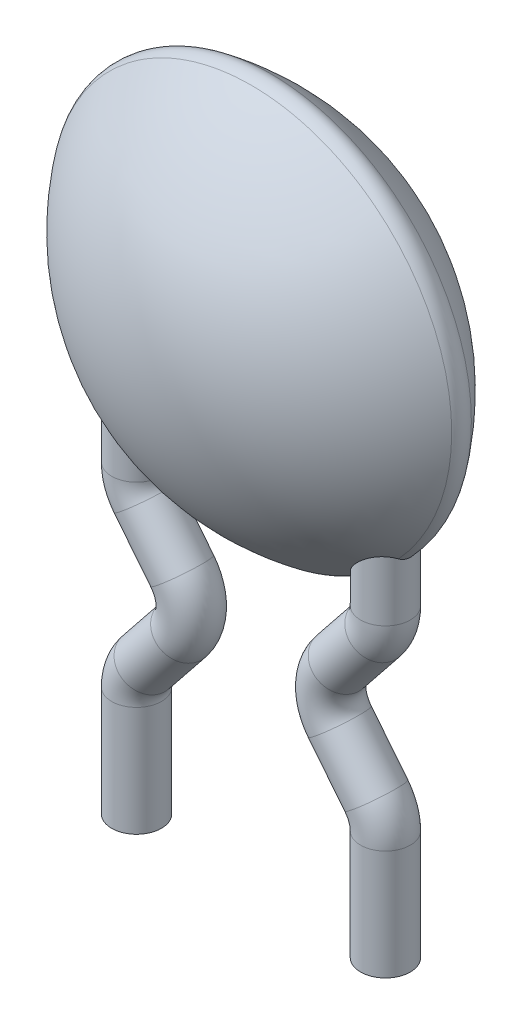
ISO-10303-21;
HEADER;
FILE_DESCRIPTION(('STEP AP214'),'2;1');
FILE_NAME('part.step','',(''),(''),'','','');
FILE_SCHEMA(('AUTOMOTIVE_DESIGN { 1 0 10303 214 1 1 1 1 }'));
ENDSEC;
DATA;
#1=APPLICATION_CONTEXT('core data for automotive mechanical design processes');
#2=APPLICATION_PROTOCOL_DEFINITION('international standard','automotive_design',2000,#1);
#3=PRODUCT_CONTEXT('',#1,'mechanical');
#4=PRODUCT('Part','Part','',(#3));
#5=PRODUCT_RELATED_PRODUCT_CATEGORY('part','',(#4));
#6=PRODUCT_DEFINITION_FORMATION('','',#4);
#7=PRODUCT_DEFINITION_CONTEXT('part definition',#1,'design');
#8=PRODUCT_DEFINITION('design','',#6,#7);
#9=PRODUCT_DEFINITION_SHAPE('','',#8);
#10=(LENGTH_UNIT() NAMED_UNIT(*) SI_UNIT(.MILLI.,.METRE.));
#11=(NAMED_UNIT(*) PLANE_ANGLE_UNIT() SI_UNIT($,.RADIAN.));
#12=(NAMED_UNIT(*) SI_UNIT($,.STERADIAN.) SOLID_ANGLE_UNIT());
#13=UNCERTAINTY_MEASURE_WITH_UNIT(LENGTH_MEASURE(1.E-05),#10,'distance_accuracy_value','');
#14=(GEOMETRIC_REPRESENTATION_CONTEXT(3) GLOBAL_UNCERTAINTY_ASSIGNED_CONTEXT((#13)) GLOBAL_UNIT_ASSIGNED_CONTEXT((#10,
#11,#12)) REPRESENTATION_CONTEXT('',''));
#15=CARTESIAN_POINT('',(0.,0.,0.));
#16=DIRECTION('',(0.,0.,1.));
#17=DIRECTION('',(1.,0.,0.));
#18=AXIS2_PLACEMENT_3D('',#15,#16,#17);
#19=CARTESIAN_POINT('',(0.,6.,-1.6583123951777));
#20=DIRECTION('',(0.,1.,0.));
#21=DIRECTION('',(0.,0.,1.));
#22=AXIS2_PLACEMENT_3D('',#19,#20,#21);
#23=SPHERICAL_SURFACE('',#22,3.);
#24=CARTESIAN_POINT('',(0.,6.,0.118450885369835));
#25=DIRECTION('',(0.,0.,1.));
#26=DIRECTION('',(-1.,0.,0.));
#27=AXIS2_PLACEMENT_3D('',#24,#25,#26);
#28=CIRCLE('',#27,2.41725303700253);
#29=CARTESIAN_POINT('',(1.77562544830821,4.35979680764296,0.118450885369837));
#30=VERTEX_POINT('',#29);
#31=CARTESIAN_POINT('',(-1.77562544830821,4.35979680764296,0.118450885369835));
#32=VERTEX_POINT('',#31);
#33=EDGE_CURVE('E11',#30,#32,#28,.T.);
#34=ORIENTED_EDGE('',*,*,#33,.T.);
#35=CARTESIAN_POINT('',(-1.77562544830821,4.35979680764296,0.118450885369835));
#36=CARTESIAN_POINT('',(-1.77177194447377,4.36534779995318,0.12742743215577));
#37=CARTESIAN_POINT('',(-1.76736227008728,4.37048542995669,0.136469091716055));
#38=CARTESIAN_POINT('',(-1.75733642965905,4.37968148603928,0.154548561014207));
#39=CARTESIAN_POINT('',(-1.7517100337576,4.38373006468388,0.163585643281366));
#40=CARTESIAN_POINT('',(-1.73917931603369,4.39041077196987,0.181418194730474));
#41=CARTESIAN_POINT('',(-1.73226647474882,4.3930329715797,0.190211575783705));
#42=CARTESIAN_POINT('',(-1.71732227815066,4.39653275959631,0.207116951426043));
#43=CARTESIAN_POINT('',(-1.70929598869573,4.39741798894627,0.215231779285135));
#44=CARTESIAN_POINT('',(-1.69315503552242,4.39736299476173,0.229778603477736));
#45=CARTESIAN_POINT('',(-1.68511694885147,4.3965837632623,0.236296797505597));
#46=CARTESIAN_POINT('',(-1.66858053193431,4.39359920622341,0.248366067656619));
#47=CARTESIAN_POINT('',(-1.66008147339955,4.39139156003165,0.253915551316519));
#48=CARTESIAN_POINT('',(-1.64096635920844,4.38510626231128,0.265098093957448));
#49=CARTESIAN_POINT('',(-1.63030165034382,4.38072096850384,0.270472696149906));
#50=CARTESIAN_POINT('',(-1.60901756033425,4.37052034894376,0.279733008352717));
#51=CARTESIAN_POINT('',(-1.59839827705825,4.36470278136259,0.283616359593319));
#52=CARTESIAN_POINT('',(-1.57260082001439,4.3491179546753,0.291522421941028));
#53=CARTESIAN_POINT('',(-1.55755484354581,4.338760091375,0.294799255480215));
#54=CARTESIAN_POINT('',(-1.52820559404503,4.31663935046043,0.299040075090939));
#55=CARTESIAN_POINT('',(-1.51390380267335,4.30487381305328,0.299999607821787));
#56=CARTESIAN_POINT('',(-1.48096873162263,4.27594009402119,0.300000536806296));
#57=CARTESIAN_POINT('',(-1.46268312010573,4.25837962794931,0.298204063462647));
#58=CARTESIAN_POINT('',(-1.4276146134614,4.22233734803466,0.291681868325126));
#59=CARTESIAN_POINT('',(-1.41083391341997,4.20385424763985,0.286951944815329));
#60=CARTESIAN_POINT('',(-1.37061379795436,4.15685738948633,0.271896682734009));
#61=CARTESIAN_POINT('',(-1.34813765928644,4.12803086411685,0.2599483381057));
#62=CARTESIAN_POINT('',(-1.30694537634714,4.07027145083639,0.23100205595987));
#63=CARTESIAN_POINT('',(-1.28822697570815,4.04133863744018,0.214007163979129));
#64=CARTESIAN_POINT('',(-1.26220743756968,3.99623554654242,0.18349340221486));
#65=CARTESIAN_POINT('',(-1.25342574627078,3.97984279729134,0.171544273769393));
#66=CARTESIAN_POINT('',(-1.23757185848718,3.94746699220698,0.146129407645501));
#67=CARTESIAN_POINT('',(-1.23049671556717,3.93148327345254,0.132666343653857));
#68=CARTESIAN_POINT('',(-1.22437455169179,3.91576891826566,0.118450885369833));
#69=B_SPLINE_CURVE_WITH_KNOTS('',3,(#35,#36,#37,#38,#39,#40,#41,#42,#43,#44,#45,#46,#47,#48,#49,
#50,#51,#52,#53,#54,#55,#56,#57,#58,#59,#60,#61,#62,#63,#64,#65,#66,#67,#68),.UNSPECIFIED.,.F.,
.F.,(4,2,2,2,2,2,2,2,2,2,2,2,2,2,2,2,4),(0.,0.0337452880177605,0.0677861662502321,
0.102061065789782,0.136184848769055,0.167158097864954,0.198181793961417,0.236138337095641,
0.274154672679362,0.329528088609578,0.385007835638743,0.460947489016898,0.536996166277296,
0.651790086729908,0.766514870600366,0.832719283380476,0.898808559560753),.UNSPECIFIED.);
#70=CARTESIAN_POINT('',(-1.22437455169179,3.91576891826566,0.118450885369834));
#71=VERTEX_POINT('',#70);
#72=EDGE_CURVE('E66',#32,#71,#69,.T.);
#73=ORIENTED_EDGE('',*,*,#72,.T.);
#74=CARTESIAN_POINT('',(0.,6.,0.118450885369836));
#75=DIRECTION('',(0.,0.,1.));
#76=DIRECTION('',(-1.,0.,0.));
#77=AXIS2_PLACEMENT_3D('',#74,#75,#76);
#78=CIRCLE('',#77,2.41725303700253);
#79=CARTESIAN_POINT('',(1.22437455169179,3.91576891826566,0.118450885369835));
#80=VERTEX_POINT('',#79);
#81=EDGE_CURVE('E33',#71,#80,#78,.T.);
#82=ORIENTED_EDGE('',*,*,#81,.T.);
#83=CARTESIAN_POINT('',(1.22437455169179,3.91576891826566,0.118450885369835));
#84=CARTESIAN_POINT('',(1.22930092239239,3.92842372247154,0.129900724915372));
#85=CARTESIAN_POINT('',(1.23485059607963,3.94125486244177,0.140861640703045));
#86=CARTESIAN_POINT('',(1.24707199695731,3.96717760626011,0.161786338766388));
#87=CARTESIAN_POINT('',(1.25374292274573,3.9802690182306,0.171750825172264));
#88=CARTESIAN_POINT('',(1.27533955129213,4.0199637437782,0.200245174021742));
#89=CARTESIAN_POINT('',(1.29179404666761,4.0468508082788,0.217253497800425));
#90=CARTESIAN_POINT('',(1.32846650849411,4.10126376566344,0.247287407748771));
#91=CARTESIAN_POINT('',(1.3487578074511,4.1287909607529,0.260219465985845));
#92=CARTESIAN_POINT('',(1.39247238845603,4.18314155758901,0.28111055459828));
#93=CARTESIAN_POINT('',(1.41588269767469,4.20996735168286,0.289089447845041));
#94=CARTESIAN_POINT('',(1.45022803015928,4.24566191740957,0.295997147086889));
#95=CARTESIAN_POINT('',(1.45986558626398,4.25532146709056,0.297468200115527));
#96=CARTESIAN_POINT('',(1.47959431106201,4.27428917164689,0.299469733461145));
#97=CARTESIAN_POINT('',(1.48968580018592,4.28359706948592,0.299999538320604));
#98=CARTESIAN_POINT('',(1.513497986362,4.30451865844315,0.300000604190562));
#99=CARTESIAN_POINT('',(1.52737739666993,4.31595721443351,0.299094632396366));
#100=CARTESIAN_POINT('',(1.5558477940061,4.33752633521877,0.29510530896612));
#101=CARTESIAN_POINT('',(1.5704379851695,4.34765831862941,0.292024342784049));
#102=CARTESIAN_POINT('',(1.59549095373894,4.36303056463353,0.284595953184856));
#103=CARTESIAN_POINT('',(1.60582393831878,4.36881153690582,0.280941832190029));
#104=CARTESIAN_POINT('',(1.62655557643697,4.37905193928932,0.27223062084095));
#105=CARTESIAN_POINT('',(1.63695408859974,4.3835135977137,0.267175924353922));
#106=CARTESIAN_POINT('',(1.6558053098137,4.39012702558145,0.25655668153789));
#107=CARTESIAN_POINT('',(1.66429259546462,4.39254031243666,0.251218780216571));
#108=CARTESIAN_POINT('',(1.68086588886182,4.39598358986709,0.239561844014326));
#109=CARTESIAN_POINT('',(1.68895219364168,4.39701461957275,0.233243550148249));
#110=CARTESIAN_POINT('',(1.70447712650894,4.39759460533404,0.219761273750442));
#111=CARTESIAN_POINT('',(1.71191430168919,4.39714032003484,0.212595474598694));
#112=CARTESIAN_POINT('',(1.72590703666769,4.39478839007788,0.197663560532647));
#113=CARTESIAN_POINT('',(1.73246202944263,4.39288982227198,0.189897064521724));
#114=CARTESIAN_POINT('',(1.7444443374403,4.38787538421365,0.174191323950394));
#115=CARTESIAN_POINT('',(1.74989277035537,4.38478641426287,0.166259325393118));
#116=CARTESIAN_POINT('',(1.75982740604106,4.3776036239941,0.150261356025673));
#117=CARTESIAN_POINT('',(1.76431367274002,4.37350987047482,0.142195394154699));
#118=CARTESIAN_POINT('',(1.77096093764852,4.36610192782197,0.12889698656099));
#119=CARTESIAN_POINT('',(1.77338498705207,4.36301949485377,0.123665101406839));
#120=CARTESIAN_POINT('',(1.77562544830821,4.35979680764297,0.118450885369839));
#121=B_SPLINE_CURVE_WITH_KNOTS('',3,(#83,#84,#85,#86,#87,#88,#89,#90,#91,#92,#93,#94,#95,#96,
#97,#98,#99,#100,#101,#102,#103,#104,#105,#106,#107,#108,#109,#110,#111,#112,#113,#114,#115,
#116,#117,#118,#119,#120),.UNSPECIFIED.,.F.,.F.,(4,2,2,2,2,2,2,2,2,2,2,2,2,2,2,2,2,2,4),(0.,
0.0532412347793843,0.106444576569104,0.213419143281168,0.322694502238762,0.431528772315132,
0.472667989425504,0.51383671691086,0.567713404568972,0.621531093872992,0.658587142205838,
0.695580240839867,0.726386583160666,0.757169753387557,0.788020145528891,0.818890273030889,
0.849100241925074,0.879308202983311,0.898898345181588),.UNSPECIFIED.);
#122=EDGE_CURVE('E42',#80,#30,#121,.T.);
#123=ORIENTED_EDGE('',*,*,#122,.T.);
#124=EDGE_LOOP('',(#34,#73,#82,#123));
#125=FACE_BOUND('',#124,.T.);
#126=ADVANCED_FACE('F16',(#125),#23,.T.);
#127=CARTESIAN_POINT('',(0.,6.,0.));
#128=DIRECTION('',(0.,0.,-1.));
#129=DIRECTION('',(-1.,0.,0.));
#130=AXIS2_PLACEMENT_3D('',#127,#128,#129);
#131=TOROIDAL_SURFACE('',#130,2.2561028345357,0.19999999999999);
#132=CARTESIAN_POINT('',(1.77562544830821,4.35979680764297,0.11845088536984));
#133=CARTESIAN_POINT('',(1.77942814099474,4.35435630641426,0.109649804800582));
#134=CARTESIAN_POINT('',(1.78293752633034,4.34966318713888,0.100274848532239));
#135=CARTESIAN_POINT('',(1.78912066108772,4.34173338335793,0.0806932216809891));
#136=CARTESIAN_POINT('',(1.79179600951748,4.33849390663451,0.070488190491416));
#137=CARTESIAN_POINT('',(1.7959159883274,4.33360536288386,0.0503220933458154));
#138=CARTESIAN_POINT('',(1.79743864831195,4.33185420542867,0.0404013476177549));
#139=CARTESIAN_POINT('',(1.7994807854875,4.32952151056591,0.0203208848049185));
#140=CARTESIAN_POINT('',(1.80000013399791,4.32894012318781,0.0101611372358707));
#141=CARTESIAN_POINT('',(1.79999985360155,4.32894010946173,-0.0111014767404297));
#142=CARTESIAN_POINT('',(1.79937962709211,4.32963406730214,-0.0222046122561676));
#143=CARTESIAN_POINT('',(1.79694525199059,4.33242143908817,-0.0441025415075207));
#144=CARTESIAN_POINT('',(1.79513088881281,4.33451510456156,-0.0548972794604166));
#145=CARTESIAN_POINT('',(1.79066627265907,4.3398695175406,-0.0748825469331065));
#146=CARTESIAN_POINT('',(1.78811036741871,4.34300240132467,-0.0841285823228596));
#147=CARTESIAN_POINT('',(1.78232480469204,4.35048073691349,-0.101892156939798));
#148=CARTESIAN_POINT('',(1.7790949795535,4.35482649053699,-0.1104095141476));
#149=CARTESIAN_POINT('',(1.77562544830821,4.35979680764297,-0.118450885369832));
#150=B_SPLINE_CURVE_WITH_KNOTS('',3,(#132,#133,#134,#135,#136,#137,#138,#139,#140,#141,#142,
#143,#144,#145,#146,#147,#148,#149),.UNSPECIFIED.,.F.,.F.,(4,2,2,2,2,2,2,2,4),(0.,
0.0330128428864743,0.0659619989846288,0.0964091041337876,0.126860114043343,0.160129143915325,
0.193404153846566,0.22355859850625,0.253720553702946),.UNSPECIFIED.);
#151=CARTESIAN_POINT('',(1.77562544830821,4.35979680764297,-0.118450885369834));
#152=VERTEX_POINT('',#151);
#153=EDGE_CURVE('E87',#30,#152,#150,.T.);
#154=ORIENTED_EDGE('',*,*,#153,.T.);
#155=CARTESIAN_POINT('',(0.,6.,-0.118450885369836));
#156=DIRECTION('',(0.,0.,1.));
#157=DIRECTION('',(-1.,0.,0.));
#158=AXIS2_PLACEMENT_3D('',#155,#156,#157);
#159=CIRCLE('',#158,2.41725303700253);
#160=CARTESIAN_POINT('',(-1.77562544830821,4.35979680764297,-0.118450885369836));
#161=VERTEX_POINT('',#160);
#162=EDGE_CURVE('E83',#152,#161,#159,.T.);
#163=ORIENTED_EDGE('',*,*,#162,.T.);
#164=CARTESIAN_POINT('',(-1.77562544830821,4.35979680764297,0.118450885369834));
#165=CARTESIAN_POINT('',(-1.77942814099474,4.35435630641426,0.109649804800575));
#166=CARTESIAN_POINT('',(-1.78293752633034,4.34966318713888,0.100274848532233));
#167=CARTESIAN_POINT('',(-1.78912066108772,4.34173338335793,0.0806932216809821));
#168=CARTESIAN_POINT('',(-1.79179600951748,4.33849390663451,0.0704881904914086));
#169=CARTESIAN_POINT('',(-1.7959159883274,4.33360536288386,0.0503220933458089));
#170=CARTESIAN_POINT('',(-1.79743864831195,4.33185420542867,0.0404013476177497));
#171=CARTESIAN_POINT('',(-1.7994807854875,4.32952151056592,0.0203208848049159));
#172=CARTESIAN_POINT('',(-1.80000013399791,4.32894012318782,0.0101611372358694));
#173=CARTESIAN_POINT('',(-1.79999985360155,4.32894010946174,-0.0111014767404297));
#174=CARTESIAN_POINT('',(-1.79937962709211,4.32963406730214,-0.0222046122561675));
#175=CARTESIAN_POINT('',(-1.79694525199059,4.33242143908818,-0.0441025415075207));
#176=CARTESIAN_POINT('',(-1.79513088881281,4.33451510456157,-0.0548972794604167));
#177=CARTESIAN_POINT('',(-1.79066627265907,4.3398695175406,-0.0748825469331074));
#178=CARTESIAN_POINT('',(-1.78811036741871,4.34300240132467,-0.0841285823228611));
#179=CARTESIAN_POINT('',(-1.78232480469204,4.3504807369135,-0.101892156939801));
#180=CARTESIAN_POINT('',(-1.7790949795535,4.354826490537,-0.110409514147603));
#181=CARTESIAN_POINT('',(-1.77562544830821,4.35979680764297,-0.118450885369836));
#182=B_SPLINE_CURVE_WITH_KNOTS('',3,(#164,#165,#166,#167,#168,#169,#170,#171,#172,#173,#174,
#175,#176,#177,#178,#179,#180,#181),.UNSPECIFIED.,.F.,.F.,(4,2,2,2,2,2,2,2,4),(0.,
0.0330128428864745,0.0659619989846291,0.096409104133784,0.126860114043335,0.160129143915317,
0.193404153846559,0.223558598506245,0.253720553702942),.UNSPECIFIED.);
#183=EDGE_CURVE('E21',#32,#161,#182,.T.);
#184=ORIENTED_EDGE('',*,*,#183,.F.);
#185=ORIENTED_EDGE('',*,*,#33,.F.);
#186=EDGE_LOOP('',(#154,#163,#184,#185));
#187=FACE_BOUND('',#186,.T.);
#188=ADVANCED_FACE('F81',(#187),#131,.T.);
#189=CARTESIAN_POINT('',(1.34031242374329,2.5,0.));
#190=DIRECTION('',(0.,0.,-1.));
#191=DIRECTION('',(-1.,0.,0.));
#192=AXIS2_PLACEMENT_3D('',#189,#190,#191);
#193=TOROIDAL_SURFACE('',#192,0.500000000000005,0.3);
#194=CARTESIAN_POINT('',(0.949878019021769,2.18765247622279,0.));
#195=DIRECTION('',(-0.624695047554423,0.780868809443031,0.));
#196=DIRECTION('',(-0.780868809443031,-0.624695047554423,0.));
#197=AXIS2_PLACEMENT_3D('',#194,#195,#196);
#198=CIRCLE('',#197,0.3);
#199=CARTESIAN_POINT('',(0.715617376188857,2.00024396195646,0.));
#200=VERTEX_POINT('',#199);
#201=EDGE_CURVE('E235',#200,#200,#198,.T.);
#202=CARTESIAN_POINT('',(0.94987801902177,2.81234752377721,0.));
#203=DIRECTION('',(0.624695047554425,0.78086880944303,0.));
#204=DIRECTION('',(-0.78086880944303,0.624695047554425,0.));
#205=AXIS2_PLACEMENT_3D('',#202,#203,#204);
#206=CIRCLE('',#205,0.3);
#207=CARTESIAN_POINT('',(0.71561737618886,2.99975603804354,0.));
#208=VERTEX_POINT('',#207);
#209=EDGE_CURVE('E85',#208,#208,#206,.T.);
#210=CARTESIAN_POINT('',(1.34031242374329,2.5,0.));
#211=DIRECTION('',(0.,0.,-1.));
#212=DIRECTION('',(-1.,0.,0.));
#213=AXIS2_PLACEMENT_3D('',#210,#211,#212);
#214=CIRCLE('',#213,0.800000000000005);
#215=EDGE_CURVE('',#200,#208,#214,.T.);
#216=ORIENTED_EDGE('',*,*,#201,.T.);
#217=ORIENTED_EDGE('',*,*,#209,.F.);
#218=ORIENTED_EDGE('',*,*,#215,.T.);
#219=ORIENTED_EDGE('',*,*,#215,.F.);
#220=EDGE_LOOP('',(#216,#218,#217,#219));
#221=FACE_BOUND('',#220,.T.);
#222=ADVANCED_FACE('F431',(#221),#193,.T.);
#223=CARTESIAN_POINT('',(-1.34031242374329,2.5,0.));
#224=DIRECTION('',(0.,0.,1.));
#225=DIRECTION('',(1.,0.,0.));
#226=AXIS2_PLACEMENT_3D('',#223,#224,#225);
#227=TOROIDAL_SURFACE('',#226,0.500000000000006,0.3);
#228=CARTESIAN_POINT('',(-0.949878019021769,2.18765247622279,0.));
#229=DIRECTION('',(0.624695047554423,0.780868809443031,0.));
#230=DIRECTION('',(0.780868809443031,-0.624695047554423,0.));
#231=AXIS2_PLACEMENT_3D('',#228,#229,#230);
#232=CIRCLE('',#231,0.3);
#233=CARTESIAN_POINT('',(-0.715617376188857,2.00024396195646,0.));
#234=VERTEX_POINT('',#233);
#235=EDGE_CURVE('E238',#234,#234,#232,.T.);
#236=CARTESIAN_POINT('',(-0.94987801902177,2.81234752377721,0.));
#237=DIRECTION('',(-0.624695047554425,0.78086880944303,0.));
#238=DIRECTION('',(-0.78086880944303,-0.624695047554425,0.));
#239=AXIS2_PLACEMENT_3D('',#236,#237,#238);
#240=CIRCLE('',#239,0.3);
#241=CARTESIAN_POINT('',(-0.71561737618886,2.99975603804354,0.));
#242=VERTEX_POINT('',#241);
#243=EDGE_CURVE('E225',#242,#242,#240,.T.);
#244=CARTESIAN_POINT('',(-1.34031242374329,2.5,0.));
#245=DIRECTION('',(0.,0.,1.));
#246=DIRECTION('',(1.,0.,0.));
#247=AXIS2_PLACEMENT_3D('',#244,#245,#246);
#248=CIRCLE('',#247,0.800000000000006);
#249=EDGE_CURVE('',#234,#242,#248,.T.);
#250=ORIENTED_EDGE('',*,*,#235,.T.);
#251=ORIENTED_EDGE('',*,*,#243,.F.);
#252=ORIENTED_EDGE('',*,*,#249,.T.);
#253=ORIENTED_EDGE('',*,*,#249,.F.);
#254=EDGE_LOOP('',(#250,#252,#251,#253));
#255=FACE_BOUND('',#254,.T.);
#256=ADVANCED_FACE('F422',(#255),#227,.T.);
#257=CARTESIAN_POINT('',(1.5,3.67539052967911,0.));
#258=DIRECTION('',(0.,1.,0.));
#259=DIRECTION('',(0.,0.,1.));
#260=AXIS2_PLACEMENT_3D('',#257,#258,#259);
#261=CYLINDRICAL_SURFACE('',#260,0.3);
#262=ORIENTED_EDGE('',*,*,#153,.F.);
#263=ORIENTED_EDGE('',*,*,#122,.F.);
#264=CARTESIAN_POINT('',(1.22437455169179,3.91576891826566,0.118450885369836));
#265=CARTESIAN_POINT('',(1.21889450334762,3.90167919293905,0.105699264502702));
#266=CARTESIAN_POINT('',(1.21362717117828,3.88887867036373,0.0909999122745261));
#267=CARTESIAN_POINT('',(1.20939582426119,3.87884004480803,0.0744930402330781));
#268=CARTESIAN_POINT('',(1.2060132605784,3.87081510832913,0.0612973493625463));
#269=CARTESIAN_POINT('',(1.20324712649781,3.86443880980648,0.0466275116826474));
#270=CARTESIAN_POINT('',(1.20164112102311,3.86075440719756,0.0313365495173723));
#271=CARTESIAN_POINT('',(1.20057104838004,3.8582995099385,0.02114826525738));
#272=CARTESIAN_POINT('',(1.1999999999998,3.85700183532166,0.0105343586498762));
#273=CARTESIAN_POINT('',(1.1999999999983,3.85700183532113,-5.13445536088756E-13));
#274=B_SPLINE_CURVE_WITH_KNOTS('',3,(#264,#265,#266,#267,#268,#269,#270,#271,#272,#273),
.UNSPECIFIED.,.F.,.F.,(4,3,3,4),(0.,5.93329260980525E-05,0.000106780704252343,
0.000138461221483342),.UNSPECIFIED.);
#275=CARTESIAN_POINT('',(1.1999999999983,3.85700183532113,-5.13445536088756E-13));
#276=VERTEX_POINT('',#275);
#277=EDGE_CURVE('E76',#80,#276,#274,.T.);
#278=ORIENTED_EDGE('',*,*,#277,.T.);
#279=CARTESIAN_POINT('',(1.1999999999983,3.85700183532113,-5.13445536088756E-13));
#280=CARTESIAN_POINT('',(1.19999999999983,3.85700183532173,-0.00545516227114814));
#281=CARTESIAN_POINT('',(1.20015002751143,3.85734347425804,-0.0109224659662742));
#282=CARTESIAN_POINT('',(1.20044466711031,3.85801617866477,-0.0163279679490866));
#283=CARTESIAN_POINT('',(1.20118498821856,3.85970643779431,-0.0299100093102573));
#284=CARTESIAN_POINT('',(1.20287503839158,3.86356547985559,-0.0433021624100061));
#285=CARTESIAN_POINT('',(1.20520977671233,3.86900209816264,-0.0556661859121668));
#286=CARTESIAN_POINT('',(1.20845601918374,3.87656122420782,-0.0728572423373431));
#287=CARTESIAN_POINT('',(1.21299971619183,3.88730383176335,-0.0885602884965187));
#288=CARTESIAN_POINT('',(1.2179634224064,3.89959705319659,-0.102251498274053));
#289=CARTESIAN_POINT('',(1.22002713666395,3.90470809225618,-0.107943766027144));
#290=CARTESIAN_POINT('',(1.22217905489168,3.91012408724846,-0.113342145254478));
#291=CARTESIAN_POINT('',(1.22437455169179,3.91576891826566,-0.118450885369836));
#292=B_SPLINE_CURVE_WITH_KNOTS('',3,(#279,#280,#281,#282,#283,#284,#285,#286,#287,#288,#289,
#290,#291),.UNSPECIFIED.,.F.,.F.,(4,3,3,3,4),(0.000138461221483342,0.000154764628127234,
0.000195802383399946,0.000253060228154902,0.000276626455606272),.UNSPECIFIED.);
#293=CARTESIAN_POINT('',(1.22437455169179,3.91576891826566,-0.118450885369836));
#294=VERTEX_POINT('',#293);
#295=EDGE_CURVE('E188',#276,#294,#292,.T.);
#296=ORIENTED_EDGE('',*,*,#295,.T.);
#297=CARTESIAN_POINT('',(1.22437455169179,3.91576891826566,-0.118450885369836));
#298=CARTESIAN_POINT('',(1.22930092239239,3.92842372247154,-0.129900724915373));
#299=CARTESIAN_POINT('',(1.23485059607963,3.94125486244176,-0.140861640703046));
#300=CARTESIAN_POINT('',(1.24707199695731,3.96717760626011,-0.161786338766387));
#301=CARTESIAN_POINT('',(1.25374292274573,3.9802690182306,-0.171750825172262));
#302=CARTESIAN_POINT('',(1.27533955129213,4.0199637437782,-0.200245174021741));
#303=CARTESIAN_POINT('',(1.29179404666761,4.0468508082788,-0.217253497800425));
#304=CARTESIAN_POINT('',(1.32846650849411,4.10126376566344,-0.247287407748773));
#305=CARTESIAN_POINT('',(1.3487578074511,4.12879096075291,-0.260219465985848));
#306=CARTESIAN_POINT('',(1.39247238845604,4.18314155758901,-0.281110554598282));
#307=CARTESIAN_POINT('',(1.4158826976747,4.20996735168286,-0.289089447845042));
#308=CARTESIAN_POINT('',(1.45022803015878,4.24566191740904,-0.295997147086789));
#309=CARTESIAN_POINT('',(1.45986558626296,4.25532146708953,-0.29746820011537));
#310=CARTESIAN_POINT('',(1.47959431105989,4.27428917164489,-0.299469733460983));
#311=CARTESIAN_POINT('',(1.48968580018323,4.28359706948346,-0.299999538320491));
#312=CARTESIAN_POINT('',(1.51349798635893,4.30451865844057,-0.30000060419071));
#313=CARTESIAN_POINT('',(1.52737739666708,4.31595721443124,-0.299094632396638));
#314=CARTESIAN_POINT('',(1.55584779400373,4.33752633521709,-0.295105308966579));
#315=CARTESIAN_POINT('',(1.57043798516739,4.34765831862802,-0.29202434278457));
#316=CARTESIAN_POINT('',(1.59549095373714,4.3630305646325,-0.284595953185459));
#317=CARTESIAN_POINT('',(1.60582393831702,4.36881153690487,-0.280941832190692));
#318=CARTESIAN_POINT('',(1.62655557643529,4.37905193928856,-0.272230620841728));
#319=CARTESIAN_POINT('',(1.63695408859811,4.38351359771305,-0.267175924354756));
#320=CARTESIAN_POINT('',(1.65580530981217,4.39012702558098,-0.256556681538817));
#321=CARTESIAN_POINT('',(1.66429259546314,4.39254031243628,-0.251218780217541));
#322=CARTESIAN_POINT('',(1.68086588886044,4.39598358986687,-0.23956184401537));
#323=CARTESIAN_POINT('',(1.68895219364035,4.39701461957262,-0.233243550149324));
#324=CARTESIAN_POINT('',(1.70447712650774,4.39759460533407,-0.21976127375156));
#325=CARTESIAN_POINT('',(1.71191430168806,4.39714032003495,-0.212595474599824));
#326=CARTESIAN_POINT('',(1.72590703666669,4.39478839007812,-0.197663560533784));
#327=CARTESIAN_POINT('',(1.73246202944171,4.39288982227228,-0.189897064522856));
#328=CARTESIAN_POINT('',(1.74444433743947,4.38787538421407,-0.174191323951548));
#329=CARTESIAN_POINT('',(1.74989277035458,4.38478641426335,-0.166259325394302));
#330=CARTESIAN_POINT('',(1.75982740604035,4.3776036239947,-0.150261356026909));
#331=CARTESIAN_POINT('',(1.76431367273935,4.37350987047547,-0.142195394155957));
#332=CARTESIAN_POINT('',(1.77096093764813,4.36610192782247,-0.12889698656184));
#333=CARTESIAN_POINT('',(1.77338498705189,4.36301949485403,-0.123665101407261));
#334=CARTESIAN_POINT('',(1.77562544830821,4.35979680764296,-0.118450885369836));
#335=B_SPLINE_CURVE_WITH_KNOTS('',3,(#297,#298,#299,#300,#301,#302,#303,#304,#305,#306,#307,
#308,#309,#310,#311,#312,#313,#314,#315,#316,#317,#318,#319,#320,#321,#322,#323,#324,#325,#326,
#327,#328,#329,#330,#331,#332,#333,#334),.UNSPECIFIED.,.F.,.F.,(4,2,2,2,2,2,2,2,2,2,2,2,2,2,2,2,
2,2,4),(0.,0.053241234779381,0.106444576569097,0.213419143281166,0.322694502238769,
0.431528772315132,0.472667989423317,0.51383671690649,0.567713404565681,0.621531093870776,
0.65858714220379,0.695580240837987,0.726386583158887,0.75716975338588,0.788020145527325,
0.818890273029432,0.849100241923546,0.879308202981714,0.898898345181587),.UNSPECIFIED.);
#336=EDGE_CURVE('E117',#294,#152,#335,.T.);
#337=ORIENTED_EDGE('',*,*,#336,.T.);
#338=EDGE_LOOP('',(#262,#263,#278,#296,#337));
#339=FACE_BOUND('',#338,.T.);
#340=CARTESIAN_POINT('',(1.5,3.67539052967911,0.));
#341=DIRECTION('',(0.,1.,0.));
#342=DIRECTION('',(0.,0.,1.));
#343=AXIS2_PLACEMENT_3D('',#340,#341,#342);
#344=CIRCLE('',#343,0.3);
#345=CARTESIAN_POINT('',(1.8,3.67539052967911,0.));
#346=VERTEX_POINT('',#345);
#347=EDGE_CURVE('E193',#346,#346,#344,.T.);
#348=ORIENTED_EDGE('',*,*,#347,.T.);
#349=EDGE_LOOP('',(#348));
#350=FACE_BOUND('',#349,.T.);
#351=ADVANCED_FACE('F103',(#339,#350),#261,.T.);
#352=CARTESIAN_POINT('',(0.,6.,0.));
#353=DIRECTION('',(0.,0.,-1.));
#354=DIRECTION('',(0.,1.,0.));
#355=AXIS2_PLACEMENT_3D('',#352,#353,#354);
#356=TOROIDAL_SURFACE('',#355,2.2561028345357,0.199999999999999);
#357=ORIENTED_EDGE('',*,*,#295,.F.);
#358=ORIENTED_EDGE('',*,*,#277,.F.);
#359=ORIENTED_EDGE('',*,*,#81,.F.);
#360=CARTESIAN_POINT('',(-1.22437455169179,3.91576891826566,0.118450885369833));
#361=CARTESIAN_POINT('',(-1.21889450334763,3.90167919293906,0.105699264502711));
#362=CARTESIAN_POINT('',(-1.21362717117829,3.88887867036375,0.090999912274552));
#363=CARTESIAN_POINT('',(-1.2093958242612,3.87884004480806,0.0744930402331229));
#364=CARTESIAN_POINT('',(-1.20601326057841,3.87081510832915,0.0612973493625885));
#365=CARTESIAN_POINT('',(-1.20324712649781,3.86443880980649,0.0466275116826848));
#366=CARTESIAN_POINT('',(-1.20164112102312,3.86075440719757,0.0313365495174046));
#367=CARTESIAN_POINT('',(-1.20057104838004,3.8582995099385,0.0211482652574022));
#368=CARTESIAN_POINT('',(-1.1999999999998,3.85700183532166,0.0105343586498873));
#369=CARTESIAN_POINT('',(-1.1999999999983,3.85700183532113,-5.13445536088755E-13));
#370=B_SPLINE_CURVE_WITH_KNOTS('',3,(#360,#361,#362,#363,#364,#365,#366,#367,#368,#369),
.UNSPECIFIED.,.F.,.F.,(4,3,3,4),(0.,5.93329260979969E-05,0.000106780704252309,
0.000138461221483342),.UNSPECIFIED.);
#371=CARTESIAN_POINT('',(-1.1999999999983,3.85700183532113,-5.13445536088755E-13));
#372=VERTEX_POINT('',#371);
#373=EDGE_CURVE('E73',#71,#372,#370,.T.);
#374=ORIENTED_EDGE('',*,*,#373,.T.);
#375=CARTESIAN_POINT('',(-1.1999999999983,3.85700183532113,-5.13445536088755E-13));
#376=CARTESIAN_POINT('',(-1.19999999999983,3.85700183532173,-0.00545516227114401));
#377=CARTESIAN_POINT('',(-1.20015002751143,3.85734347425804,-0.0109224659662658));
#378=CARTESIAN_POINT('',(-1.20044466711031,3.85801617866477,-0.0163279679490742));
#379=CARTESIAN_POINT('',(-1.20118498821856,3.8597064377943,-0.0299100093102456));
#380=CARTESIAN_POINT('',(-1.20287503839158,3.86356547985559,-0.0433021624099953));
#381=CARTESIAN_POINT('',(-1.20520977671233,3.86900209816263,-0.0556661859121568));
#382=CARTESIAN_POINT('',(-1.20845601918373,3.87656122420782,-0.0728572423373322));
#383=CARTESIAN_POINT('',(-1.21299971619183,3.88730383176334,-0.0885602884965084));
#384=CARTESIAN_POINT('',(-1.21796342240639,3.89959705319658,-0.102251498274043));
#385=CARTESIAN_POINT('',(-1.22002713666395,3.90470809225617,-0.107943766027136));
#386=CARTESIAN_POINT('',(-1.22217905489168,3.91012408724845,-0.113342145254474));
#387=CARTESIAN_POINT('',(-1.22437455169179,3.91576891826566,-0.118450885369833));
#388=B_SPLINE_CURVE_WITH_KNOTS('',3,(#375,#376,#377,#378,#379,#380,#381,#382,#383,#384,#385,
#386,#387),.UNSPECIFIED.,.F.,.F.,(4,3,3,3,4),(0.000138461221483342,0.000154764628127222,
0.000195802383399936,0.000253060228154889,0.000276626455606271),.UNSPECIFIED.);
#389=CARTESIAN_POINT('',(-1.22437455169179,3.91576891826566,-0.118450885369835));
#390=VERTEX_POINT('',#389);
#391=EDGE_CURVE('E209',#372,#390,#388,.T.);
#392=ORIENTED_EDGE('',*,*,#391,.T.);
#393=CARTESIAN_POINT('',(0.,6.,-0.118450885369836));
#394=DIRECTION('',(0.,0.,1.));
#395=DIRECTION('',(-1.,0.,0.));
#396=AXIS2_PLACEMENT_3D('',#393,#394,#395);
#397=CIRCLE('',#396,2.41725303700253);
#398=EDGE_CURVE('E204',#390,#294,#397,.T.);
#399=ORIENTED_EDGE('',*,*,#398,.T.);
#400=EDGE_LOOP('',(#357,#358,#359,#374,#392,#399));
#401=FACE_BOUND('',#400,.T.);
#402=ADVANCED_FACE('F354',(#401),#356,.T.);
#403=CARTESIAN_POINT('',(1.,3.6753905296791,0.));
#404=DIRECTION('',(0.,0.,1.));
#405=DIRECTION('',(1.,0.,0.));
#406=AXIS2_PLACEMENT_3D('',#403,#404,#405);
#407=TOROIDAL_SURFACE('',#406,0.499999999999998,0.3);
#408=CARTESIAN_POINT('',(1.39043440472152,3.36304300590189,0.));
#409=DIRECTION('',(0.624695047554424,0.78086880944303,0.));
#410=DIRECTION('',(0.78086880944303,-0.624695047554424,0.));
#411=AXIS2_PLACEMENT_3D('',#408,#409,#410);
#412=CIRCLE('',#411,0.3);
#413=CARTESIAN_POINT('',(1.62469504755443,3.17563449163557,0.));
#414=VERTEX_POINT('',#413);
#415=EDGE_CURVE('E210',#414,#414,#412,.T.);
#416=CARTESIAN_POINT('',(1.,3.6753905296791,0.));
#417=DIRECTION('',(0.,0.,1.));
#418=DIRECTION('',(1.,0.,0.));
#419=AXIS2_PLACEMENT_3D('',#416,#417,#418);
#420=CIRCLE('',#419,0.799999999999998);
#421=EDGE_CURVE('',#414,#346,#420,.T.);
#422=ORIENTED_EDGE('',*,*,#415,.T.);
#423=ORIENTED_EDGE('',*,*,#347,.F.);
#424=ORIENTED_EDGE('',*,*,#421,.T.);
#425=ORIENTED_EDGE('',*,*,#421,.F.);
#426=EDGE_LOOP('',(#422,#424,#423,#425));
#427=FACE_BOUND('',#426,.T.);
#428=ADVANCED_FACE('F130',(#427),#407,.T.);
#429=CARTESIAN_POINT('',(-1.5,3.67539052967911,0.));
#430=DIRECTION('',(0.,1.,0.));
#431=DIRECTION('',(0.,0.,1.));
#432=AXIS2_PLACEMENT_3D('',#429,#430,#431);
#433=CYLINDRICAL_SURFACE('',#432,0.3);
#434=ORIENTED_EDGE('',*,*,#72,.F.);
#435=ORIENTED_EDGE('',*,*,#183,.T.);
#436=CARTESIAN_POINT('',(-1.22437455169179,3.91576891826566,-0.118450885369834));
#437=CARTESIAN_POINT('',(-1.22930092239239,3.92842372247154,-0.129900724915371));
#438=CARTESIAN_POINT('',(-1.23485059607963,3.94125486244176,-0.140861640703043));
#439=CARTESIAN_POINT('',(-1.2470719969573,3.9671776062601,-0.161786338766384));
#440=CARTESIAN_POINT('',(-1.25374292274572,3.98026901823059,-0.17175082517226));
#441=CARTESIAN_POINT('',(-1.27533955129213,4.0199637437782,-0.200245174021739));
#442=CARTESIAN_POINT('',(-1.29179404666761,4.0468508082788,-0.217253497800422));
#443=CARTESIAN_POINT('',(-1.32846650849411,4.10126376566343,-0.247287407748771));
#444=CARTESIAN_POINT('',(-1.3487578074511,4.1287909607529,-0.260219465985846));
#445=CARTESIAN_POINT('',(-1.39247238845604,4.18314155758901,-0.28111055459828));
#446=CARTESIAN_POINT('',(-1.41588269767469,4.20996735168286,-0.289089447845041));
#447=CARTESIAN_POINT('',(-1.45022803015878,4.24566191740904,-0.295997147086788));
#448=CARTESIAN_POINT('',(-1.45986558626295,4.25532146708953,-0.29746820011537));
#449=CARTESIAN_POINT('',(-1.47959431105989,4.27428917164489,-0.299469733460983));
#450=CARTESIAN_POINT('',(-1.48968580018323,4.28359706948346,-0.299999538320491));
#451=CARTESIAN_POINT('',(-1.51349798635893,4.30451865844057,-0.30000060419071));
#452=CARTESIAN_POINT('',(-1.52737739666708,4.31595721443124,-0.299094632396638));
#453=CARTESIAN_POINT('',(-1.55584779400373,4.33752633521709,-0.295105308966579));
#454=CARTESIAN_POINT('',(-1.57043798516739,4.34765831862802,-0.29202434278457));
#455=CARTESIAN_POINT('',(-1.59549095373714,4.3630305646325,-0.284595953185459));
#456=CARTESIAN_POINT('',(-1.60582393831702,4.36881153690487,-0.280941832190692));
#457=CARTESIAN_POINT('',(-1.62655557643529,4.37905193928856,-0.272230620841728));
#458=CARTESIAN_POINT('',(-1.63695408859811,4.38351359771305,-0.267175924354756));
#459=CARTESIAN_POINT('',(-1.65580530981217,4.39012702558098,-0.256556681538817));
#460=CARTESIAN_POINT('',(-1.66429259546314,4.39254031243628,-0.251218780217541));
#461=CARTESIAN_POINT('',(-1.68086588886044,4.39598358986687,-0.23956184401537));
#462=CARTESIAN_POINT('',(-1.68895219364035,4.39701461957262,-0.233243550149324));
#463=CARTESIAN_POINT('',(-1.70447712650774,4.39759460533407,-0.219761273751561));
#464=CARTESIAN_POINT('',(-1.71191430168806,4.39714032003495,-0.212595474599824));
#465=CARTESIAN_POINT('',(-1.72590703666669,4.39478839007812,-0.197663560533784));
#466=CARTESIAN_POINT('',(-1.73246202944171,4.39288982227228,-0.189897064522856));
#467=CARTESIAN_POINT('',(-1.74444433743947,4.38787538421407,-0.174191323951548));
#468=CARTESIAN_POINT('',(-1.74989277035458,4.38478641426335,-0.166259325394301));
#469=CARTESIAN_POINT('',(-1.75982740604035,4.3776036239947,-0.150261356026908));
#470=CARTESIAN_POINT('',(-1.76431367273935,4.37350987047547,-0.142195394155956));
#471=CARTESIAN_POINT('',(-1.77096093764813,4.36610192782247,-0.128896986561841));
#472=CARTESIAN_POINT('',(-1.77338498705189,4.36301949485403,-0.123665101407264));
#473=CARTESIAN_POINT('',(-1.77562544830821,4.35979680764296,-0.118450885369841));
#474=B_SPLINE_CURVE_WITH_KNOTS('',3,(#436,#437,#438,#439,#440,#441,#442,#443,#444,#445,#446,
#447,#448,#449,#450,#451,#452,#453,#454,#455,#456,#457,#458,#459,#460,#461,#462,#463,#464,#465,
#466,#467,#468,#469,#470,#471,#472,#473),.UNSPECIFIED.,.F.,.F.,(4,2,2,2,2,2,2,2,2,2,2,2,2,2,2,2,
2,2,4),(0.,0.0532412347793798,0.106444576569096,0.213419143281165,0.322694502238768,
0.431528772315131,0.472667989423318,0.513836716906494,0.567713404565684,0.62153109387078,
0.658587142203795,0.695580240837991,0.726386583158891,0.757169753385884,0.788020145527329,
0.818890273029436,0.84910024192355,0.879308202981719,0.898898345181586),.UNSPECIFIED.);
#475=EDGE_CURVE('E84',#390,#161,#474,.T.);
#476=ORIENTED_EDGE('',*,*,#475,.F.);
#477=ORIENTED_EDGE('',*,*,#391,.F.);
#478=ORIENTED_EDGE('',*,*,#373,.F.);
#479=EDGE_LOOP('',(#434,#435,#476,#477,#478));
#480=FACE_BOUND('',#479,.T.);
#481=CARTESIAN_POINT('',(-1.5,3.67539052967911,0.));
#482=DIRECTION('',(0.,1.,0.));
#483=DIRECTION('',(0.,0.,1.));
#484=AXIS2_PLACEMENT_3D('',#481,#482,#483);
#485=CIRCLE('',#484,0.3);
#486=CARTESIAN_POINT('',(-1.8,3.67539052967911,0.));
#487=VERTEX_POINT('',#486);
#488=EDGE_CURVE('E229',#487,#487,#485,.T.);
#489=ORIENTED_EDGE('',*,*,#488,.T.);
#490=EDGE_LOOP('',(#489));
#491=FACE_BOUND('',#490,.T.);
#492=ADVANCED_FACE('F68',(#480,#491),#433,.T.);
#493=CARTESIAN_POINT('',(0.94987801902177,2.81234752377721,0.));
#494=DIRECTION('',(0.624695047554425,0.78086880944303,0.));
#495=DIRECTION('',(-0.78086880944303,0.624695047554425,0.));
#496=AXIS2_PLACEMENT_3D('',#493,#494,#495);
#497=CYLINDRICAL_SURFACE('',#496,0.3);
#498=ORIENTED_EDGE('',*,*,#415,.F.);
#499=EDGE_LOOP('',(#498));
#500=FACE_BOUND('',#499,.T.);
#501=ORIENTED_EDGE('',*,*,#209,.T.);
#502=EDGE_LOOP('',(#501));
#503=FACE_BOUND('',#502,.T.);
#504=ADVANCED_FACE('F129',(#500,#503),#497,.T.);
#505=CARTESIAN_POINT('',(-1.,3.6753905296791,0.));
#506=DIRECTION('',(0.,0.,-1.));
#507=DIRECTION('',(-1.,0.,0.));
#508=AXIS2_PLACEMENT_3D('',#505,#506,#507);
#509=TOROIDAL_SURFACE('',#508,0.499999999999998,0.3);
#510=CARTESIAN_POINT('',(-1.39043440472152,3.36304300590189,0.));
#511=DIRECTION('',(-0.624695047554424,0.78086880944303,0.));
#512=DIRECTION('',(-0.78086880944303,-0.624695047554424,0.));
#513=AXIS2_PLACEMENT_3D('',#510,#511,#512);
#514=CIRCLE('',#513,0.3);
#515=CARTESIAN_POINT('',(-1.62469504755443,3.17563449163557,0.));
#516=VERTEX_POINT('',#515);
#517=EDGE_CURVE('E232',#516,#516,#514,.T.);
#518=CARTESIAN_POINT('',(-1.,3.6753905296791,0.));
#519=DIRECTION('',(0.,0.,-1.));
#520=DIRECTION('',(-1.,0.,0.));
#521=AXIS2_PLACEMENT_3D('',#518,#519,#520);
#522=CIRCLE('',#521,0.799999999999998);
#523=EDGE_CURVE('',#516,#487,#522,.T.);
#524=ORIENTED_EDGE('',*,*,#517,.T.);
#525=ORIENTED_EDGE('',*,*,#488,.F.);
#526=ORIENTED_EDGE('',*,*,#523,.T.);
#527=ORIENTED_EDGE('',*,*,#523,.F.);
#528=EDGE_LOOP('',(#524,#526,#525,#527));
#529=FACE_BOUND('',#528,.T.);
#530=ADVANCED_FACE('F135',(#529),#509,.T.);
#531=CARTESIAN_POINT('',(-0.94987801902177,2.81234752377721,0.));
#532=DIRECTION('',(-0.624695047554425,0.78086880944303,0.));
#533=DIRECTION('',(-0.78086880944303,-0.624695047554425,0.));
#534=AXIS2_PLACEMENT_3D('',#531,#532,#533);
#535=CYLINDRICAL_SURFACE('',#534,0.3);
#536=ORIENTED_EDGE('',*,*,#517,.F.);
#537=EDGE_LOOP('',(#536));
#538=FACE_BOUND('',#537,.T.);
#539=ORIENTED_EDGE('',*,*,#243,.T.);
#540=EDGE_LOOP('',(#539));
#541=FACE_BOUND('',#540,.T.);
#542=ADVANCED_FACE('F137',(#538,#541),#535,.T.);
#543=CARTESIAN_POINT('',(1.39043440472152,1.63695699409811,0.));
#544=DIRECTION('',(-0.624695047554425,0.78086880944303,0.));
#545=DIRECTION('',(-0.78086880944303,-0.624695047554425,0.));
#546=AXIS2_PLACEMENT_3D('',#543,#544,#545);
#547=CYLINDRICAL_SURFACE('',#546,0.3);
#548=ORIENTED_EDGE('',*,*,#201,.F.);
#549=EDGE_LOOP('',(#548));
#550=FACE_BOUND('',#549,.T.);
#551=CARTESIAN_POINT('',(1.39043440472152,1.63695699409811,0.));
#552=DIRECTION('',(-0.624695047554425,0.78086880944303,0.));
#553=DIRECTION('',(-0.78086880944303,-0.624695047554425,0.));
#554=AXIS2_PLACEMENT_3D('',#551,#552,#553);
#555=CIRCLE('',#554,0.3);
#556=CARTESIAN_POINT('',(1.62469504755442,1.82436550836443,0.));
#557=VERTEX_POINT('',#556);
#558=EDGE_CURVE('E241',#557,#557,#555,.T.);
#559=ORIENTED_EDGE('',*,*,#558,.T.);
#560=EDGE_LOOP('',(#559));
#561=FACE_BOUND('',#560,.T.);
#562=ADVANCED_FACE('F140',(#550,#561),#547,.T.);
#563=CARTESIAN_POINT('',(1.00000000000001,1.3246094703209,0.));
#564=DIRECTION('',(0.,0.,1.));
#565=DIRECTION('',(1.,0.,0.));
#566=AXIS2_PLACEMENT_3D('',#563,#564,#565);
#567=TOROIDAL_SURFACE('',#566,0.499999999999993,0.3);
#568=CARTESIAN_POINT('',(1.5,1.32460947032089,0.));
#569=DIRECTION('',(0.,1.,0.));
#570=DIRECTION('',(1.,0.,0.));
#571=AXIS2_PLACEMENT_3D('',#568,#569,#570);
#572=CIRCLE('',#571,0.3);
#573=CARTESIAN_POINT('',(1.8,1.32460947032089,0.));
#574=VERTEX_POINT('',#573);
#575=EDGE_CURVE('E177',#574,#574,#572,.T.);
#576=CARTESIAN_POINT('',(1.00000000000001,1.3246094703209,0.));
#577=DIRECTION('',(0.,0.,1.));
#578=DIRECTION('',(1.,0.,0.));
#579=AXIS2_PLACEMENT_3D('',#576,#577,#578);
#580=CIRCLE('',#579,0.799999999999993);
#581=EDGE_CURVE('',#574,#557,#580,.T.);
#582=ORIENTED_EDGE('',*,*,#575,.T.);
#583=ORIENTED_EDGE('',*,*,#558,.F.);
#584=ORIENTED_EDGE('',*,*,#581,.T.);
#585=ORIENTED_EDGE('',*,*,#581,.F.);
#586=EDGE_LOOP('',(#582,#584,#583,#585));
#587=FACE_BOUND('',#586,.T.);
#588=ADVANCED_FACE('F144',(#587),#567,.T.);
#589=CARTESIAN_POINT('',(-1.39043440472152,1.63695699409811,0.));
#590=DIRECTION('',(0.624695047554425,0.78086880944303,0.));
#591=DIRECTION('',(-0.78086880944303,0.624695047554425,0.));
#592=AXIS2_PLACEMENT_3D('',#589,#590,#591);
#593=CYLINDRICAL_SURFACE('',#592,0.3);
#594=ORIENTED_EDGE('',*,*,#235,.F.);
#595=EDGE_LOOP('',(#594));
#596=FACE_BOUND('',#595,.T.);
#597=CARTESIAN_POINT('',(-1.39043440472152,1.63695699409811,0.));
#598=DIRECTION('',(0.624695047554425,0.78086880944303,0.));
#599=DIRECTION('',(-0.78086880944303,0.624695047554425,0.));
#600=AXIS2_PLACEMENT_3D('',#597,#598,#599);
#601=CIRCLE('',#600,0.3);
#602=CARTESIAN_POINT('',(-1.62469504755442,1.82436550836443,0.));
#603=VERTEX_POINT('',#602);
#604=EDGE_CURVE('E173',#603,#603,#601,.T.);
#605=ORIENTED_EDGE('',*,*,#604,.T.);
#606=EDGE_LOOP('',(#605));
#607=FACE_BOUND('',#606,.T.);
#608=ADVANCED_FACE('F146',(#596,#607),#593,.T.);
#609=CARTESIAN_POINT('',(1.5,1.32460947032089,0.));
#610=DIRECTION('',(0.,-1.,0.));
#611=DIRECTION('',(1.,0.,0.));
#612=AXIS2_PLACEMENT_3D('',#609,#610,#611);
#613=CYLINDRICAL_SURFACE('',#612,0.3);
#614=CARTESIAN_POINT('',(1.5,0.,0.));
#615=DIRECTION('',(0.,1.,0.));
#616=DIRECTION('',(1.,0.,0.));
#617=AXIS2_PLACEMENT_3D('',#614,#615,#616);
#618=CIRCLE('',#617,0.3);
#619=CARTESIAN_POINT('',(1.8,0.,0.));
#620=VERTEX_POINT('',#619);
#621=EDGE_CURVE('E172',#620,#620,#618,.T.);
#622=ORIENTED_EDGE('',*,*,#621,.T.);
#623=EDGE_LOOP('',(#622));
#624=FACE_BOUND('',#623,.T.);
#625=ORIENTED_EDGE('',*,*,#575,.F.);
#626=EDGE_LOOP('',(#625));
#627=FACE_BOUND('',#626,.T.);
#628=ADVANCED_FACE('F149',(#624,#627),#613,.T.);
#629=CARTESIAN_POINT('',(-1.00000000000001,1.3246094703209,0.));
#630=DIRECTION('',(0.,0.,-1.));
#631=DIRECTION('',(-1.,0.,0.));
#632=AXIS2_PLACEMENT_3D('',#629,#630,#631);
#633=TOROIDAL_SURFACE('',#632,0.499999999999993,0.3);
#634=CARTESIAN_POINT('',(-1.5,1.32460947032089,0.));
#635=DIRECTION('',(0.,1.,0.));
#636=DIRECTION('',(-1.,0.,0.));
#637=AXIS2_PLACEMENT_3D('',#634,#635,#636);
#638=CIRCLE('',#637,0.3);
#639=CARTESIAN_POINT('',(-1.8,1.32460947032089,0.));
#640=VERTEX_POINT('',#639);
#641=EDGE_CURVE('E174',#640,#640,#638,.T.);
#642=CARTESIAN_POINT('',(-1.00000000000001,1.3246094703209,0.));
#643=DIRECTION('',(0.,0.,-1.));
#644=DIRECTION('',(-1.,0.,0.));
#645=AXIS2_PLACEMENT_3D('',#642,#643,#644);
#646=CIRCLE('',#645,0.799999999999993);
#647=EDGE_CURVE('',#640,#603,#646,.T.);
#648=ORIENTED_EDGE('',*,*,#641,.T.);
#649=ORIENTED_EDGE('',*,*,#604,.F.);
#650=ORIENTED_EDGE('',*,*,#647,.T.);
#651=ORIENTED_EDGE('',*,*,#647,.F.);
#652=EDGE_LOOP('',(#648,#650,#649,#651));
#653=FACE_BOUND('',#652,.T.);
#654=ADVANCED_FACE('F153',(#653),#633,.T.);
#655=CARTESIAN_POINT('',(-1.5,1.32460947032089,0.));
#656=DIRECTION('',(0.,-1.,0.));
#657=DIRECTION('',(1.,0.,0.));
#658=AXIS2_PLACEMENT_3D('',#655,#656,#657);
#659=CYLINDRICAL_SURFACE('',#658,0.3);
#660=CARTESIAN_POINT('',(-1.5,0.,0.));
#661=DIRECTION('',(0.,1.,0.));
#662=DIRECTION('',(1.,0.,0.));
#663=AXIS2_PLACEMENT_3D('',#660,#661,#662);
#664=CIRCLE('',#663,0.3);
#665=CARTESIAN_POINT('',(-1.2,0.,0.));
#666=VERTEX_POINT('',#665);
#667=EDGE_CURVE('E75',#666,#666,#664,.T.);
#668=ORIENTED_EDGE('',*,*,#667,.T.);
#669=EDGE_LOOP('',(#668));
#670=FACE_BOUND('',#669,.T.);
#671=ORIENTED_EDGE('',*,*,#641,.F.);
#672=EDGE_LOOP('',(#671));
#673=FACE_BOUND('',#672,.T.);
#674=ADVANCED_FACE('F155',(#670,#673),#659,.T.);
#675=CARTESIAN_POINT('',(0.,6.,1.6583123951777));
#676=DIRECTION('',(0.,-1.,0.));
#677=DIRECTION('',(-0.812358843925972,0.,-0.583157876303886));
#678=AXIS2_PLACEMENT_3D('',#675,#676,#677);
#679=SPHERICAL_SURFACE('',#678,3.);
#680=ORIENTED_EDGE('',*,*,#398,.F.);
#681=ORIENTED_EDGE('',*,*,#475,.T.);
#682=ORIENTED_EDGE('',*,*,#162,.F.);
#683=ORIENTED_EDGE('',*,*,#336,.F.);
#684=EDGE_LOOP('',(#680,#681,#682,#683));
#685=FACE_BOUND('',#684,.T.);
#686=ADVANCED_FACE('F18',(#685),#679,.T.);
#687=CARTESIAN_POINT('',(1.5,0.,0.));
#688=DIRECTION('',(0.,1.,0.));
#689=DIRECTION('',(0.,0.,1.));
#690=AXIS2_PLACEMENT_3D('',#687,#688,#689);
#691=PLANE('',#690);
#692=ORIENTED_EDGE('',*,*,#621,.F.);
#693=EDGE_LOOP('',(#692));
#694=FACE_BOUND('',#693,.T.);
#695=ADVANCED_FACE('F158',(#694),#691,.F.);
#696=CARTESIAN_POINT('',(-1.5,0.,0.));
#697=DIRECTION('',(0.,1.,0.));
#698=DIRECTION('',(0.,0.,1.));
#699=AXIS2_PLACEMENT_3D('',#696,#697,#698);
#700=PLANE('',#699);
#701=ORIENTED_EDGE('',*,*,#667,.F.);
#702=EDGE_LOOP('',(#701));
#703=FACE_BOUND('',#702,.T.);
#704=ADVANCED_FACE('F108',(#703),#700,.F.);
#705=CLOSED_SHELL('',(#126,#188,#222,#256,#351,#402,#428,#492,#504,#530,#542,#562,#588,#608,
#628,#654,#674,#686,#695,#704));
#706=MANIFOLD_SOLID_BREP('B1',#705);
#707=ADVANCED_BREP_SHAPE_REPRESENTATION('',(#18,#706),#14);
#708=SHAPE_DEFINITION_REPRESENTATION(#9,#707);
ENDSEC;
END-ISO-10303-21;
